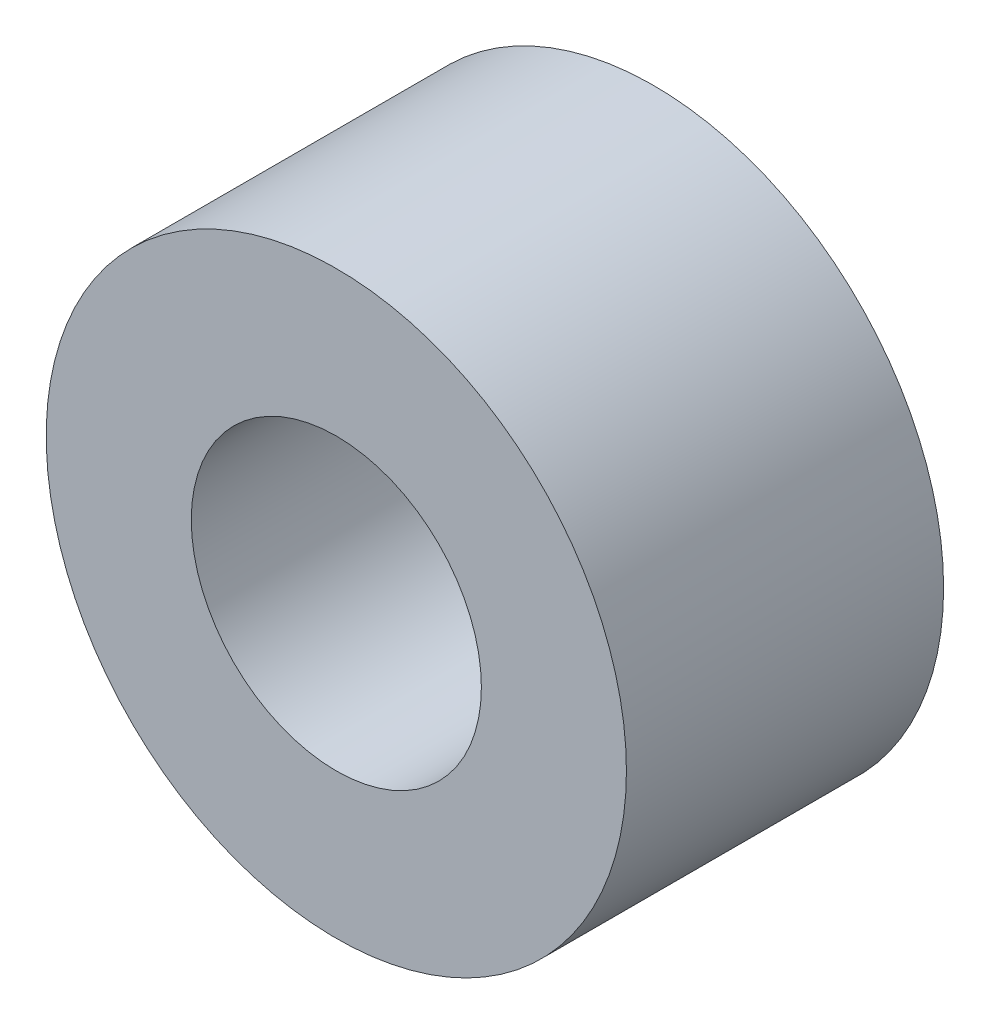
ISO-10303-21;
HEADER;
FILE_DESCRIPTION(('STEP AP214'),'2;1');
FILE_NAME('part.step','',(''),(''),'','','');
FILE_SCHEMA(('AUTOMOTIVE_DESIGN { 1 0 10303 214 1 1 1 1 }'));
ENDSEC;
DATA;
#1=APPLICATION_CONTEXT('core data for automotive mechanical design processes');
#2=APPLICATION_PROTOCOL_DEFINITION('international standard','automotive_design',2000,#1);
#3=PRODUCT_CONTEXT('',#1,'mechanical');
#4=PRODUCT('Part','Part','',(#3));
#5=PRODUCT_RELATED_PRODUCT_CATEGORY('part','',(#4));
#6=PRODUCT_DEFINITION_FORMATION('','',#4);
#7=PRODUCT_DEFINITION_CONTEXT('part definition',#1,'design');
#8=PRODUCT_DEFINITION('design','',#6,#7);
#9=PRODUCT_DEFINITION_SHAPE('','',#8);
#10=(LENGTH_UNIT() NAMED_UNIT(*) SI_UNIT(.MILLI.,.METRE.));
#11=(NAMED_UNIT(*) PLANE_ANGLE_UNIT() SI_UNIT($,.RADIAN.));
#12=(NAMED_UNIT(*) SI_UNIT($,.STERADIAN.) SOLID_ANGLE_UNIT());
#13=UNCERTAINTY_MEASURE_WITH_UNIT(LENGTH_MEASURE(1.E-05),#10,'distance_accuracy_value','');
#14=(GEOMETRIC_REPRESENTATION_CONTEXT(3) GLOBAL_UNCERTAINTY_ASSIGNED_CONTEXT((#13)) GLOBAL_UNIT_ASSIGNED_CONTEXT((#10,
#11,#12)) REPRESENTATION_CONTEXT('',''));
#15=CARTESIAN_POINT('',(0.,0.,0.));
#16=DIRECTION('',(0.,0.,1.));
#17=DIRECTION('',(1.,0.,0.));
#18=AXIS2_PLACEMENT_3D('',#15,#16,#17);
#19=CARTESIAN_POINT('',(0.,0.,5.207));
#20=DIRECTION('',(0.,0.,1.));
#21=DIRECTION('',(1.,0.,0.));
#22=AXIS2_PLACEMENT_3D('',#19,#20,#21);
#23=PLANE('',#22);
#24=CARTESIAN_POINT('',(0.,0.,5.207));
#25=DIRECTION('',(0.,0.,1.));
#26=DIRECTION('',(1.,0.,0.));
#27=AXIS2_PLACEMENT_3D('',#24,#25,#26);
#28=CIRCLE('',#27,4.7625);
#29=CARTESIAN_POINT('',(4.7625,0.,5.207));
#30=VERTEX_POINT('',#29);
#31=EDGE_CURVE('E10',#30,#30,#28,.T.);
#32=ORIENTED_EDGE('',*,*,#31,.T.);
#33=EDGE_LOOP('',(#32));
#34=FACE_BOUND('',#33,.T.);
#35=CARTESIAN_POINT('',(0.,0.,5.207));
#36=DIRECTION('',(0.,0.,1.));
#37=DIRECTION('',(1.,0.,0.));
#38=AXIS2_PLACEMENT_3D('',#35,#36,#37);
#39=CIRCLE('',#38,2.38125);
#40=CARTESIAN_POINT('',(2.38125,0.,5.207));
#41=VERTEX_POINT('',#40);
#42=EDGE_CURVE('E50',#41,#41,#39,.T.);
#43=ORIENTED_EDGE('',*,*,#42,.F.);
#44=EDGE_LOOP('',(#43));
#45=FACE_BOUND('',#44,.T.);
#46=ADVANCED_FACE('F37',(#34,#45),#23,.T.);
#47=CARTESIAN_POINT('',(0.,0.,0.));
#48=DIRECTION('',(0.,0.,1.));
#49=DIRECTION('',(1.,0.,0.));
#50=AXIS2_PLACEMENT_3D('',#47,#48,#49);
#51=PLANE('',#50);
#52=CARTESIAN_POINT('',(0.,0.,0.));
#53=DIRECTION('',(0.,0.,1.));
#54=DIRECTION('',(1.,0.,0.));
#55=AXIS2_PLACEMENT_3D('',#52,#53,#54);
#56=CIRCLE('',#55,4.7625);
#57=CARTESIAN_POINT('',(4.7625,0.,0.));
#58=VERTEX_POINT('',#57);
#59=EDGE_CURVE('E41',#58,#58,#56,.T.);
#60=ORIENTED_EDGE('',*,*,#59,.F.);
#61=EDGE_LOOP('',(#60));
#62=FACE_BOUND('',#61,.T.);
#63=CARTESIAN_POINT('',(0.,0.,0.));
#64=DIRECTION('',(0.,0.,1.));
#65=DIRECTION('',(1.,0.,0.));
#66=AXIS2_PLACEMENT_3D('',#63,#64,#65);
#67=CIRCLE('',#66,2.38125);
#68=CARTESIAN_POINT('',(2.38125,0.,0.));
#69=VERTEX_POINT('',#68);
#70=EDGE_CURVE('E52',#69,#69,#67,.T.);
#71=ORIENTED_EDGE('',*,*,#70,.T.);
#72=EDGE_LOOP('',(#71));
#73=FACE_BOUND('',#72,.T.);
#74=ADVANCED_FACE('F64',(#62,#73),#51,.F.);
#75=CARTESIAN_POINT('',(0.,0.,5.207));
#76=DIRECTION('',(0.,0.,-1.));
#77=DIRECTION('',(-1.,0.,0.));
#78=AXIS2_PLACEMENT_3D('',#75,#76,#77);
#79=CYLINDRICAL_SURFACE('',#78,4.7625);
#80=ORIENTED_EDGE('',*,*,#31,.F.);
#81=EDGE_LOOP('',(#80));
#82=FACE_BOUND('',#81,.T.);
#83=ORIENTED_EDGE('',*,*,#59,.T.);
#84=EDGE_LOOP('',(#83));
#85=FACE_BOUND('',#84,.T.);
#86=ADVANCED_FACE('F39',(#82,#85),#79,.T.);
#87=CARTESIAN_POINT('',(0.,0.,5.207));
#88=DIRECTION('',(0.,0.,-1.));
#89=DIRECTION('',(-1.,0.,0.));
#90=AXIS2_PLACEMENT_3D('',#87,#88,#89);
#91=CYLINDRICAL_SURFACE('',#90,2.38125);
#92=ORIENTED_EDGE('',*,*,#42,.T.);
#93=EDGE_LOOP('',(#92));
#94=FACE_BOUND('',#93,.T.);
#95=ORIENTED_EDGE('',*,*,#70,.F.);
#96=EDGE_LOOP('',(#95));
#97=FACE_BOUND('',#96,.T.);
#98=ADVANCED_FACE('F60',(#94,#97),#91,.F.);
#99=CLOSED_SHELL('',(#46,#74,#86,#98));
#100=MANIFOLD_SOLID_BREP('B2',#99);
#101=ADVANCED_BREP_SHAPE_REPRESENTATION('',(#18,#100),#14);
#102=SHAPE_DEFINITION_REPRESENTATION(#9,#101);
ENDSEC;
END-ISO-10303-21;
